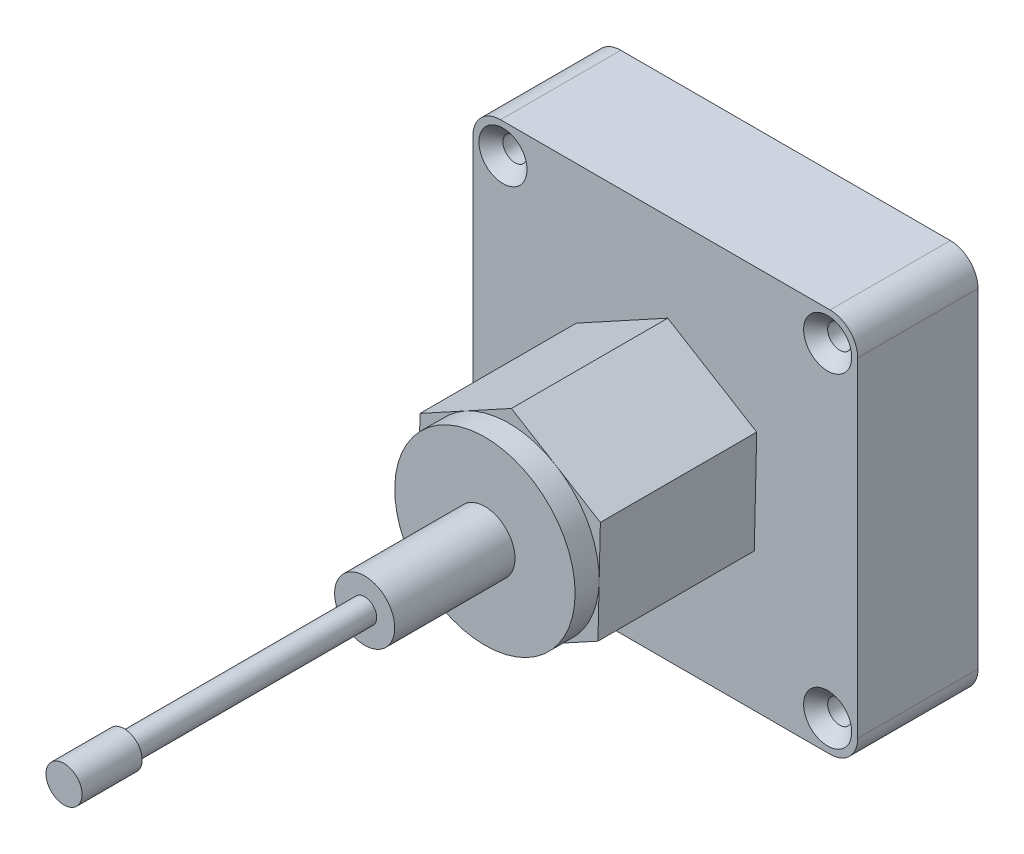
ISO-10303-21;
HEADER;
FILE_DESCRIPTION(('STEP AP214'),'2;1');
FILE_NAME('part.step','',(''),(''),'','','');
FILE_SCHEMA(('AUTOMOTIVE_DESIGN { 1 0 10303 214 1 1 1 1 }'));
ENDSEC;
DATA;
#1=APPLICATION_CONTEXT('core data for automotive mechanical design processes');
#2=APPLICATION_PROTOCOL_DEFINITION('international standard','automotive_design',2000,#1);
#3=PRODUCT_CONTEXT('',#1,'mechanical');
#4=PRODUCT('Part','Part','',(#3));
#5=PRODUCT_RELATED_PRODUCT_CATEGORY('part','',(#4));
#6=PRODUCT_DEFINITION_FORMATION('','',#4);
#7=PRODUCT_DEFINITION_CONTEXT('part definition',#1,'design');
#8=PRODUCT_DEFINITION('design','',#6,#7);
#9=PRODUCT_DEFINITION_SHAPE('','',#8);
#10=(LENGTH_UNIT() NAMED_UNIT(*) SI_UNIT(.MILLI.,.METRE.));
#11=(NAMED_UNIT(*) PLANE_ANGLE_UNIT() SI_UNIT($,.RADIAN.));
#12=(NAMED_UNIT(*) SI_UNIT($,.STERADIAN.) SOLID_ANGLE_UNIT());
#13=UNCERTAINTY_MEASURE_WITH_UNIT(LENGTH_MEASURE(1.E-05),#10,'distance_accuracy_value','');
#14=(GEOMETRIC_REPRESENTATION_CONTEXT(3) GLOBAL_UNCERTAINTY_ASSIGNED_CONTEXT((#13)) GLOBAL_UNIT_ASSIGNED_CONTEXT((#10,
#11,#12)) REPRESENTATION_CONTEXT('',''));
#15=CARTESIAN_POINT('',(0.,0.,0.));
#16=DIRECTION('',(0.,0.,1.));
#17=DIRECTION('',(1.,0.,0.));
#18=AXIS2_PLACEMENT_3D('',#15,#16,#17);
#19=CARTESIAN_POINT('',(0.,0.,0.));
#20=DIRECTION('',(0.,0.,1.));
#21=DIRECTION('',(1.,0.,0.));
#22=AXIS2_PLACEMENT_3D('',#19,#20,#21);
#23=PLANE('',#22);
#24=CARTESIAN_POINT('',(0.,0.,0.));
#25=DIRECTION('',(0.,0.,1.));
#26=DIRECTION('',(1.,0.,0.));
#27=AXIS2_PLACEMENT_3D('',#24,#25,#26);
#28=CIRCLE('',#27,7.5);
#29=CARTESIAN_POINT('',(3.90024317987458,6.4060989016594,0.));
#30=VERTEX_POINT('',#29);
#31=CARTESIAN_POINT('',(-3.59772279805534,6.58075912553809,0.));
#32=VERTEX_POINT('',#31);
#33=EDGE_CURVE('E233',#30,#32,#28,.T.);
#34=ORIENTED_EDGE('',*,*,#33,.F.);
#35=DIRECTION('',(-0.854146520221254,0.520032423983277,0.));
#36=VECTOR('',#35,1.);
#37=CARTESIAN_POINT('',(7.598806105203,4.15429245185381,0.));
#38=LINE('',#37,#36);
#39=CARTESIAN_POINT('',(0.201680254546159,8.657905351465,0.));
#40=VERTEX_POINT('',#39);
#41=EDGE_CURVE('E250',#30,#40,#38,.T.);
#42=ORIENTED_EDGE('',*,*,#41,.T.);
#43=DIRECTION('',(-0.877434550071745,-0.479696373074046,0.));
#44=VECTOR('',#43,1.);
#45=CARTESIAN_POINT('',(0.201680254546159,8.657905351465,0.));
#46=LINE('',#45,#44);
#47=EDGE_CURVE('E254',#40,#32,#46,.T.);
#48=ORIENTED_EDGE('',*,*,#47,.T.);
#49=EDGE_LOOP('',(#34,#42,#48));
#50=FACE_BOUND('',#49,.T.);
#51=ADVANCED_FACE('F45',(#50),#23,.T.);
#52=CARTESIAN_POINT('',(-7.49796597792992,0.174660223878687,0.));
#53=VERTEX_POINT('',#52);
#54=EDGE_CURVE('E236',#32,#53,#28,.T.);
#55=ORIENTED_EDGE('',*,*,#54,.F.);
#56=CARTESIAN_POINT('',(-7.39712585065684,4.50361289961119,0.));
#57=VERTEX_POINT('',#56);
#58=EDGE_CURVE('E253',#32,#57,#46,.T.);
#59=ORIENTED_EDGE('',*,*,#58,.T.);
#60=DIRECTION('',(-0.0232880298504916,-0.999728797057323,0.));
#61=VECTOR('',#60,1.);
#62=CARTESIAN_POINT('',(-7.39712585065684,4.50361289961119,0.));
#63=LINE('',#62,#61);
#64=EDGE_CURVE('E258',#57,#53,#63,.T.);
#65=ORIENTED_EDGE('',*,*,#64,.T.);
#66=EDGE_LOOP('',(#55,#59,#65));
#67=FACE_BOUND('',#66,.T.);
#68=ADVANCED_FACE('F406',(#67),#23,.T.);
#69=CARTESIAN_POINT('',(-3.90024317987458,-6.4060989016594,0.));
#70=VERTEX_POINT('',#69);
#71=EDGE_CURVE('E69',#53,#70,#28,.T.);
#72=ORIENTED_EDGE('',*,*,#71,.F.);
#73=CARTESIAN_POINT('',(-7.598806105203,-4.15429245185381,0.));
#74=VERTEX_POINT('',#73);
#75=EDGE_CURVE('E257',#53,#74,#63,.T.);
#76=ORIENTED_EDGE('',*,*,#75,.T.);
#77=DIRECTION('',(0.854146520221254,-0.520032423983278,0.));
#78=VECTOR('',#77,1.);
#79=CARTESIAN_POINT('',(-7.598806105203,-4.15429245185381,0.));
#80=LINE('',#79,#78);
#81=EDGE_CURVE('E262',#74,#70,#80,.T.);
#82=ORIENTED_EDGE('',*,*,#81,.T.);
#83=EDGE_LOOP('',(#72,#76,#82));
#84=FACE_BOUND('',#83,.T.);
#85=ADVANCED_FACE('F413',(#84),#23,.T.);
#86=CARTESIAN_POINT('',(3.59772279805534,-6.58075912553809,0.));
#87=VERTEX_POINT('',#86);
#88=EDGE_CURVE('E61',#70,#87,#28,.T.);
#89=ORIENTED_EDGE('',*,*,#88,.F.);
#90=CARTESIAN_POINT('',(-0.201680254546153,-8.657905351465,0.));
#91=VERTEX_POINT('',#90);
#92=EDGE_CURVE('E261',#70,#91,#80,.T.);
#93=ORIENTED_EDGE('',*,*,#92,.T.);
#94=DIRECTION('',(0.877434550071745,0.479696373074046,0.));
#95=VECTOR('',#94,1.);
#96=CARTESIAN_POINT('',(-0.201680254546153,-8.657905351465,0.));
#97=LINE('',#96,#95);
#98=EDGE_CURVE('E244',#91,#87,#97,.T.);
#99=ORIENTED_EDGE('',*,*,#98,.T.);
#100=EDGE_LOOP('',(#89,#93,#99));
#101=FACE_BOUND('',#100,.T.);
#102=ADVANCED_FACE('F434',(#101),#23,.T.);
#103=CARTESIAN_POINT('',(7.49796597792992,-0.174660223878683,0.));
#104=VERTEX_POINT('',#103);
#105=EDGE_CURVE('E444',#87,#104,#28,.T.);
#106=ORIENTED_EDGE('',*,*,#105,.F.);
#107=CARTESIAN_POINT('',(7.39712585065685,-4.50361289961119,0.));
#108=VERTEX_POINT('',#107);
#109=EDGE_CURVE('E240',#87,#108,#97,.T.);
#110=ORIENTED_EDGE('',*,*,#109,.T.);
#111=DIRECTION('',(0.0232880298504911,0.999728797057323,0.));
#112=VECTOR('',#111,1.);
#113=CARTESIAN_POINT('',(7.39712585065685,-4.50361289961119,0.));
#114=LINE('',#113,#112);
#115=EDGE_CURVE('E247',#108,#104,#114,.T.);
#116=ORIENTED_EDGE('',*,*,#115,.T.);
#117=EDGE_LOOP('',(#106,#110,#116));
#118=FACE_BOUND('',#117,.T.);
#119=ADVANCED_FACE('F422',(#118),#23,.T.);
#120=CARTESIAN_POINT('',(-0.201680254546153,-8.657905351465,-2.));
#121=DIRECTION('',(0.479696373074046,-0.877434550071745,0.));
#122=DIRECTION('',(0.877434550071745,0.479696373074046,0.));
#123=AXIS2_PLACEMENT_3D('',#120,#121,#122);
#124=PLANE('',#123);
#125=ORIENTED_EDGE('',*,*,#98,.F.);
#126=DIRECTION('',(0.,0.,1.));
#127=VECTOR('',#126,1.);
#128=CARTESIAN_POINT('',(-0.201680254546153,-8.657905351465,-2.));
#129=LINE('',#128,#127);
#130=CARTESIAN_POINT('',(-0.201680254546153,-8.657905351465,-13.));
#131=VERTEX_POINT('',#130);
#132=EDGE_CURVE('E265',#131,#91,#129,.T.);
#133=ORIENTED_EDGE('',*,*,#132,.F.);
#134=DIRECTION('',(-0.877434550071745,-0.479696373074046,0.));
#135=VECTOR('',#134,1.);
#136=CARTESIAN_POINT('',(-0.201680254546153,-8.657905351465,-13.));
#137=LINE('',#136,#135);
#138=CARTESIAN_POINT('',(7.39712585065685,-4.50361289961119,-13.));
#139=VERTEX_POINT('',#138);
#140=EDGE_CURVE('E196',#139,#131,#137,.T.);
#141=ORIENTED_EDGE('',*,*,#140,.F.);
#142=DIRECTION('',(0.,0.,1.));
#143=VECTOR('',#142,1.);
#144=CARTESIAN_POINT('',(7.39712585065685,-4.50361289961119,-2.));
#145=LINE('',#144,#143);
#146=EDGE_CURVE('E264',#139,#108,#145,.T.);
#147=ORIENTED_EDGE('',*,*,#146,.T.);
#148=ORIENTED_EDGE('',*,*,#109,.F.);
#149=EDGE_LOOP('',(#125,#133,#141,#147,#148));
#150=FACE_BOUND('',#149,.T.);
#151=ADVANCED_FACE('F433',(#150),#124,.T.);
#152=CARTESIAN_POINT('',(-7.598806105203,-4.15429245185381,-2.));
#153=DIRECTION('',(-0.520032423983278,-0.854146520221254,0.));
#154=DIRECTION('',(0.854146520221254,-0.520032423983278,0.));
#155=AXIS2_PLACEMENT_3D('',#152,#153,#154);
#156=PLANE('',#155);
#157=ORIENTED_EDGE('',*,*,#81,.F.);
#158=DIRECTION('',(0.,0.,1.));
#159=VECTOR('',#158,1.);
#160=CARTESIAN_POINT('',(-7.598806105203,-4.15429245185381,-2.));
#161=LINE('',#160,#159);
#162=CARTESIAN_POINT('',(-7.598806105203,-4.15429245185381,-13.));
#163=VERTEX_POINT('',#162);
#164=EDGE_CURVE('E268',#163,#74,#161,.T.);
#165=ORIENTED_EDGE('',*,*,#164,.F.);
#166=DIRECTION('',(-0.854146520221254,0.520032423983278,0.));
#167=VECTOR('',#166,1.);
#168=CARTESIAN_POINT('',(-7.598806105203,-4.15429245185381,-13.));
#169=LINE('',#168,#167);
#170=EDGE_CURVE('E204',#131,#163,#169,.T.);
#171=ORIENTED_EDGE('',*,*,#170,.F.);
#172=ORIENTED_EDGE('',*,*,#132,.T.);
#173=ORIENTED_EDGE('',*,*,#92,.F.);
#174=EDGE_LOOP('',(#157,#165,#171,#172,#173));
#175=FACE_BOUND('',#174,.T.);
#176=ADVANCED_FACE('F440',(#175),#156,.T.);
#177=CARTESIAN_POINT('',(-7.39712585065684,4.50361289961119,-2.));
#178=DIRECTION('',(-0.999728797057323,0.0232880298504916,0.));
#179=DIRECTION('',(-0.0232880298504916,-0.999728797057323,0.));
#180=AXIS2_PLACEMENT_3D('',#177,#178,#179);
#181=PLANE('',#180);
#182=ORIENTED_EDGE('',*,*,#64,.F.);
#183=DIRECTION('',(0.,0.,1.));
#184=VECTOR('',#183,1.);
#185=CARTESIAN_POINT('',(-7.39712585065684,4.50361289961119,-2.));
#186=LINE('',#185,#184);
#187=CARTESIAN_POINT('',(-7.39712585065684,4.50361289961119,-13.));
#188=VERTEX_POINT('',#187);
#189=EDGE_CURVE('E271',#188,#57,#186,.T.);
#190=ORIENTED_EDGE('',*,*,#189,.F.);
#191=DIRECTION('',(0.0232880298504916,0.999728797057323,0.));
#192=VECTOR('',#191,1.);
#193=CARTESIAN_POINT('',(-7.39712585065684,4.50361289961119,-13.));
#194=LINE('',#193,#192);
#195=EDGE_CURVE('E207',#163,#188,#194,.T.);
#196=ORIENTED_EDGE('',*,*,#195,.F.);
#197=ORIENTED_EDGE('',*,*,#164,.T.);
#198=ORIENTED_EDGE('',*,*,#75,.F.);
#199=EDGE_LOOP('',(#182,#190,#196,#197,#198));
#200=FACE_BOUND('',#199,.T.);
#201=ADVANCED_FACE('F465',(#200),#181,.T.);
#202=CARTESIAN_POINT('',(0.201680254546159,8.657905351465,-2.));
#203=DIRECTION('',(-0.479696373074046,0.877434550071745,0.));
#204=DIRECTION('',(-0.877434550071745,-0.479696373074046,0.));
#205=AXIS2_PLACEMENT_3D('',#202,#203,#204);
#206=PLANE('',#205);
#207=ORIENTED_EDGE('',*,*,#47,.F.);
#208=DIRECTION('',(0.,0.,1.));
#209=VECTOR('',#208,1.);
#210=CARTESIAN_POINT('',(0.201680254546159,8.657905351465,-2.));
#211=LINE('',#210,#209);
#212=CARTESIAN_POINT('',(0.201680254546159,8.657905351465,-13.));
#213=VERTEX_POINT('',#212);
#214=EDGE_CURVE('E274',#213,#40,#211,.T.);
#215=ORIENTED_EDGE('',*,*,#214,.F.);
#216=DIRECTION('',(0.877434550071745,0.479696373074046,0.));
#217=VECTOR('',#216,1.);
#218=CARTESIAN_POINT('',(0.201680254546159,8.657905351465,-13.));
#219=LINE('',#218,#217);
#220=EDGE_CURVE('E210',#188,#213,#219,.T.);
#221=ORIENTED_EDGE('',*,*,#220,.F.);
#222=ORIENTED_EDGE('',*,*,#189,.T.);
#223=ORIENTED_EDGE('',*,*,#58,.F.);
#224=EDGE_LOOP('',(#207,#215,#221,#222,#223));
#225=FACE_BOUND('',#224,.T.);
#226=ADVANCED_FACE('F456',(#225),#206,.T.);
#227=CARTESIAN_POINT('',(7.598806105203,4.15429245185381,-2.));
#228=DIRECTION('',(0.520032423983277,0.854146520221254,0.));
#229=DIRECTION('',(-0.854146520221254,0.520032423983277,0.));
#230=AXIS2_PLACEMENT_3D('',#227,#228,#229);
#231=PLANE('',#230);
#232=CARTESIAN_POINT('',(7.598806105203,4.15429245185381,0.));
#233=VERTEX_POINT('',#232);
#234=EDGE_CURVE('E251',#233,#30,#38,.T.);
#235=ORIENTED_EDGE('',*,*,#234,.F.);
#236=DIRECTION('',(0.,0.,1.));
#237=VECTOR('',#236,1.);
#238=CARTESIAN_POINT('',(7.598806105203,4.15429245185381,-2.));
#239=LINE('',#238,#237);
#240=CARTESIAN_POINT('',(7.598806105203,4.15429245185381,-13.));
#241=VERTEX_POINT('',#240);
#242=EDGE_CURVE('E277',#241,#233,#239,.T.);
#243=ORIENTED_EDGE('',*,*,#242,.F.);
#244=DIRECTION('',(0.854146520221254,-0.520032423983277,0.));
#245=VECTOR('',#244,1.);
#246=CARTESIAN_POINT('',(7.598806105203,4.15429245185381,-13.));
#247=LINE('',#246,#245);
#248=EDGE_CURVE('E213',#213,#241,#247,.T.);
#249=ORIENTED_EDGE('',*,*,#248,.F.);
#250=ORIENTED_EDGE('',*,*,#214,.T.);
#251=ORIENTED_EDGE('',*,*,#41,.F.);
#252=EDGE_LOOP('',(#235,#243,#249,#250,#251));
#253=FACE_BOUND('',#252,.T.);
#254=ADVANCED_FACE('F429',(#253),#231,.T.);
#255=CARTESIAN_POINT('',(7.39712585065685,-4.50361289961119,-2.));
#256=DIRECTION('',(0.999728797057323,-0.0232880298504911,0.));
#257=DIRECTION('',(0.0232880298504911,0.999728797057323,0.));
#258=AXIS2_PLACEMENT_3D('',#255,#256,#257);
#259=PLANE('',#258);
#260=ORIENTED_EDGE('',*,*,#115,.F.);
#261=ORIENTED_EDGE('',*,*,#146,.F.);
#262=DIRECTION('',(-0.0232880298504911,-0.999728797057323,0.));
#263=VECTOR('',#262,1.);
#264=CARTESIAN_POINT('',(7.39712585065685,-4.50361289961119,-13.));
#265=LINE('',#264,#263);
#266=EDGE_CURVE('E193',#241,#139,#265,.T.);
#267=ORIENTED_EDGE('',*,*,#266,.F.);
#268=ORIENTED_EDGE('',*,*,#242,.T.);
#269=EDGE_CURVE('E246',#104,#233,#114,.T.);
#270=ORIENTED_EDGE('',*,*,#269,.F.);
#271=EDGE_LOOP('',(#260,#261,#267,#268,#270));
#272=FACE_BOUND('',#271,.T.);
#273=ADVANCED_FACE('F420',(#272),#259,.T.);
#274=EDGE_CURVE('E243',#104,#30,#28,.T.);
#275=ORIENTED_EDGE('',*,*,#274,.F.);
#276=ORIENTED_EDGE('',*,*,#269,.T.);
#277=ORIENTED_EDGE('',*,*,#234,.T.);
#278=EDGE_LOOP('',(#275,#276,#277));
#279=FACE_BOUND('',#278,.T.);
#280=ADVANCED_FACE('F409',(#279),#23,.T.);
#281=CARTESIAN_POINT('',(0.,0.,2.));
#282=DIRECTION('',(0.,0.,-1.));
#283=DIRECTION('',(-1.,0.,0.));
#284=AXIS2_PLACEMENT_3D('',#281,#282,#283);
#285=CYLINDRICAL_SURFACE('',#284,7.5);
#286=CARTESIAN_POINT('',(0.,0.,2.));
#287=DIRECTION('',(0.,0.,1.));
#288=DIRECTION('',(1.,0.,0.));
#289=AXIS2_PLACEMENT_3D('',#286,#287,#288);
#290=CIRCLE('',#289,7.5);
#291=CARTESIAN_POINT('',(7.5,0.,2.));
#292=VERTEX_POINT('',#291);
#293=EDGE_CURVE('E237',#292,#292,#290,.T.);
#294=ORIENTED_EDGE('',*,*,#293,.F.);
#295=EDGE_LOOP('',(#294));
#296=FACE_BOUND('',#295,.T.);
#297=ORIENTED_EDGE('',*,*,#33,.T.);
#298=ORIENTED_EDGE('',*,*,#54,.T.);
#299=ORIENTED_EDGE('',*,*,#71,.T.);
#300=ORIENTED_EDGE('',*,*,#88,.T.);
#301=ORIENTED_EDGE('',*,*,#105,.T.);
#302=ORIENTED_EDGE('',*,*,#274,.T.);
#303=EDGE_LOOP('',(#297,#298,#299,#300,#301,#302));
#304=FACE_BOUND('',#303,.T.);
#305=ADVANCED_FACE('F419',(#296,#304),#285,.T.);
#306=CARTESIAN_POINT('',(0.,0.,2.));
#307=DIRECTION('',(0.,0.,1.));
#308=DIRECTION('',(1.,0.,0.));
#309=AXIS2_PLACEMENT_3D('',#306,#307,#308);
#310=PLANE('',#309);
#311=CARTESIAN_POINT('',(0.,0.,2.));
#312=DIRECTION('',(0.,0.,1.));
#313=DIRECTION('',(1.,0.,0.));
#314=AXIS2_PLACEMENT_3D('',#311,#312,#313);
#315=CIRCLE('',#314,2.5);
#316=CARTESIAN_POINT('',(2.5,0.,2.));
#317=VERTEX_POINT('',#316);
#318=EDGE_CURVE('E230',#317,#317,#315,.T.);
#319=ORIENTED_EDGE('',*,*,#318,.F.);
#320=EDGE_LOOP('',(#319));
#321=FACE_BOUND('',#320,.T.);
#322=ORIENTED_EDGE('',*,*,#293,.T.);
#323=EDGE_LOOP('',(#322));
#324=FACE_BOUND('',#323,.T.);
#325=ADVANCED_FACE('F427',(#321,#324),#310,.T.);
#326=CARTESIAN_POINT('',(0.,0.,12.));
#327=DIRECTION('',(0.,0.,-1.));
#328=DIRECTION('',(-1.,0.,0.));
#329=AXIS2_PLACEMENT_3D('',#326,#327,#328);
#330=CYLINDRICAL_SURFACE('',#329,2.5);
#331=CARTESIAN_POINT('',(0.,0.,12.));
#332=DIRECTION('',(0.,0.,1.));
#333=DIRECTION('',(1.,0.,0.));
#334=AXIS2_PLACEMENT_3D('',#331,#332,#333);
#335=CIRCLE('',#334,2.5);
#336=CARTESIAN_POINT('',(2.5,0.,12.));
#337=VERTEX_POINT('',#336);
#338=EDGE_CURVE('E225',#337,#337,#335,.T.);
#339=ORIENTED_EDGE('',*,*,#338,.F.);
#340=EDGE_LOOP('',(#339));
#341=FACE_BOUND('',#340,.T.);
#342=ORIENTED_EDGE('',*,*,#318,.T.);
#343=EDGE_LOOP('',(#342));
#344=FACE_BOUND('',#343,.T.);
#345=ADVANCED_FACE('F739',(#341,#344),#330,.T.);
#346=CARTESIAN_POINT('',(0.,0.,12.));
#347=DIRECTION('',(0.,0.,1.));
#348=DIRECTION('',(1.,0.,0.));
#349=AXIS2_PLACEMENT_3D('',#346,#347,#348);
#350=PLANE('',#349);
#351=CARTESIAN_POINT('',(0.,0.,12.));
#352=DIRECTION('',(0.,0.,1.));
#353=DIRECTION('',(1.,0.,0.));
#354=AXIS2_PLACEMENT_3D('',#351,#352,#353);
#355=CIRCLE('',#354,1.);
#356=CARTESIAN_POINT('',(1.,0.,12.));
#357=VERTEX_POINT('',#356);
#358=EDGE_CURVE('E226',#357,#357,#355,.T.);
#359=ORIENTED_EDGE('',*,*,#358,.F.);
#360=EDGE_LOOP('',(#359));
#361=FACE_BOUND('',#360,.T.);
#362=ORIENTED_EDGE('',*,*,#338,.T.);
#363=EDGE_LOOP('',(#362));
#364=FACE_BOUND('',#363,.T.);
#365=ADVANCED_FACE('F728',(#361,#364),#350,.T.);
#366=CARTESIAN_POINT('',(0.,0.,32.));
#367=DIRECTION('',(0.,0.,-1.));
#368=DIRECTION('',(-1.,0.,0.));
#369=AXIS2_PLACEMENT_3D('',#366,#367,#368);
#370=CYLINDRICAL_SURFACE('',#369,1.);
#371=CARTESIAN_POINT('',(0.,0.,32.));
#372=DIRECTION('',(0.,0.,1.));
#373=DIRECTION('',(1.,0.,0.));
#374=AXIS2_PLACEMENT_3D('',#371,#372,#373);
#375=CIRCLE('',#374,1.);
#376=CARTESIAN_POINT('',(1.,0.,32.));
#377=VERTEX_POINT('',#376);
#378=EDGE_CURVE('E220',#377,#377,#375,.T.);
#379=ORIENTED_EDGE('',*,*,#378,.F.);
#380=EDGE_LOOP('',(#379));
#381=FACE_BOUND('',#380,.T.);
#382=ORIENTED_EDGE('',*,*,#358,.T.);
#383=EDGE_LOOP('',(#382));
#384=FACE_BOUND('',#383,.T.);
#385=ADVANCED_FACE('F717',(#381,#384),#370,.T.);
#386=CARTESIAN_POINT('',(0.,0.,37.));
#387=DIRECTION('',(0.,0.,-1.));
#388=DIRECTION('',(-1.,0.,0.));
#389=AXIS2_PLACEMENT_3D('',#386,#387,#388);
#390=CYLINDRICAL_SURFACE('',#389,1.5);
#391=CARTESIAN_POINT('',(0.,0.,37.));
#392=DIRECTION('',(0.,0.,1.));
#393=DIRECTION('',(1.,0.,0.));
#394=AXIS2_PLACEMENT_3D('',#391,#392,#393);
#395=CIRCLE('',#394,1.5);
#396=CARTESIAN_POINT('',(1.5,0.,37.));
#397=VERTEX_POINT('',#396);
#398=EDGE_CURVE('E217',#397,#397,#395,.T.);
#399=ORIENTED_EDGE('',*,*,#398,.F.);
#400=EDGE_LOOP('',(#399));
#401=FACE_BOUND('',#400,.T.);
#402=CARTESIAN_POINT('',(0.,0.,32.));
#403=DIRECTION('',(0.,0.,1.));
#404=DIRECTION('',(1.,0.,0.));
#405=AXIS2_PLACEMENT_3D('',#402,#403,#404);
#406=CIRCLE('',#405,1.5);
#407=CARTESIAN_POINT('',(1.5,0.,32.));
#408=VERTEX_POINT('',#407);
#409=EDGE_CURVE('E216',#408,#408,#406,.T.);
#410=ORIENTED_EDGE('',*,*,#409,.T.);
#411=EDGE_LOOP('',(#410));
#412=FACE_BOUND('',#411,.T.);
#413=ADVANCED_FACE('F707',(#401,#412),#390,.T.);
#414=CARTESIAN_POINT('',(0.,0.,37.));
#415=DIRECTION('',(0.,0.,1.));
#416=DIRECTION('',(1.,0.,0.));
#417=AXIS2_PLACEMENT_3D('',#414,#415,#416);
#418=PLANE('',#417);
#419=ORIENTED_EDGE('',*,*,#398,.T.);
#420=EDGE_LOOP('',(#419));
#421=FACE_BOUND('',#420,.T.);
#422=ADVANCED_FACE('F401',(#421),#418,.T.);
#423=CARTESIAN_POINT('',(0.,0.,32.));
#424=DIRECTION('',(0.,0.,1.));
#425=DIRECTION('',(1.,0.,0.));
#426=AXIS2_PLACEMENT_3D('',#423,#424,#425);
#427=PLANE('',#426);
#428=ORIENTED_EDGE('',*,*,#378,.T.);
#429=EDGE_LOOP('',(#428));
#430=FACE_BOUND('',#429,.T.);
#431=ORIENTED_EDGE('',*,*,#409,.F.);
#432=EDGE_LOOP('',(#431));
#433=FACE_BOUND('',#432,.T.);
#434=ADVANCED_FACE('F396',(#430,#433),#427,.F.);
#435=CARTESIAN_POINT('',(-13.7,13.7,-23.));
#436=DIRECTION('',(0.,0.,1.));
#437=DIRECTION('',(1.,0.,0.));
#438=AXIS2_PLACEMENT_3D('',#435,#436,#437);
#439=PLANE('',#438);
#440=CARTESIAN_POINT('',(-13.7,13.7,-23.));
#441=DIRECTION('',(0.,0.,-1.));
#442=DIRECTION('',(1.,0.,0.));
#443=AXIS2_PLACEMENT_3D('',#440,#441,#442);
#444=CIRCLE('',#443,2.3);
#445=CARTESIAN_POINT('',(-16.,13.7,-23.));
#446=VERTEX_POINT('',#445);
#447=CARTESIAN_POINT('',(-13.7,16.,-23.));
#448=VERTEX_POINT('',#447);
#449=EDGE_CURVE('E178',#446,#448,#444,.T.);
#450=ORIENTED_EDGE('',*,*,#449,.T.);
#451=DIRECTION('',(1.,0.,0.));
#452=VECTOR('',#451,1.);
#453=CARTESIAN_POINT('',(13.7,16.,-23.));
#454=LINE('',#453,#452);
#455=CARTESIAN_POINT('',(13.7,16.,-23.));
#456=VERTEX_POINT('',#455);
#457=EDGE_CURVE('E167',#448,#456,#454,.T.);
#458=ORIENTED_EDGE('',*,*,#457,.T.);
#459=CARTESIAN_POINT('',(13.7,13.7,-23.));
#460=DIRECTION('',(0.,0.,-1.));
#461=DIRECTION('',(1.,0.,0.));
#462=AXIS2_PLACEMENT_3D('',#459,#460,#461);
#463=CIRCLE('',#462,2.3);
#464=CARTESIAN_POINT('',(16.,13.7,-23.));
#465=VERTEX_POINT('',#464);
#466=EDGE_CURVE('E177',#456,#465,#463,.T.);
#467=ORIENTED_EDGE('',*,*,#466,.T.);
#468=DIRECTION('',(0.,-1.,0.));
#469=VECTOR('',#468,1.);
#470=CARTESIAN_POINT('',(16.,13.7,-23.));
#471=LINE('',#470,#469);
#472=CARTESIAN_POINT('',(16.,-13.7,-23.));
#473=VERTEX_POINT('',#472);
#474=EDGE_CURVE('E363',#465,#473,#471,.T.);
#475=ORIENTED_EDGE('',*,*,#474,.T.);
#476=CARTESIAN_POINT('',(13.7,-13.7,-23.));
#477=DIRECTION('',(0.,0.,-1.));
#478=DIRECTION('',(1.,0.,0.));
#479=AXIS2_PLACEMENT_3D('',#476,#477,#478);
#480=CIRCLE('',#479,2.3);
#481=CARTESIAN_POINT('',(13.7,-16.,-23.));
#482=VERTEX_POINT('',#481);
#483=EDGE_CURVE('E378',#473,#482,#480,.T.);
#484=ORIENTED_EDGE('',*,*,#483,.T.);
#485=DIRECTION('',(-1.,0.,0.));
#486=VECTOR('',#485,1.);
#487=CARTESIAN_POINT('',(13.7,-16.,-23.));
#488=LINE('',#487,#486);
#489=CARTESIAN_POINT('',(-13.7,-16.,-23.));
#490=VERTEX_POINT('',#489);
#491=EDGE_CURVE('E375',#482,#490,#488,.T.);
#492=ORIENTED_EDGE('',*,*,#491,.T.);
#493=CARTESIAN_POINT('',(-13.7,-13.7,-23.));
#494=DIRECTION('',(0.,0.,-1.));
#495=DIRECTION('',(-1.,0.,0.));
#496=AXIS2_PLACEMENT_3D('',#493,#494,#495);
#497=CIRCLE('',#496,2.3);
#498=CARTESIAN_POINT('',(-16.,-13.7,-23.));
#499=VERTEX_POINT('',#498);
#500=EDGE_CURVE('E377',#490,#499,#497,.T.);
#501=ORIENTED_EDGE('',*,*,#500,.T.);
#502=DIRECTION('',(0.,1.,0.));
#503=VECTOR('',#502,1.);
#504=CARTESIAN_POINT('',(-16.,13.7,-23.));
#505=LINE('',#504,#503);
#506=EDGE_CURVE('E184',#499,#446,#505,.T.);
#507=ORIENTED_EDGE('',*,*,#506,.T.);
#508=EDGE_LOOP('',(#450,#458,#467,#475,#484,#492,#501,#507));
#509=FACE_BOUND('',#508,.T.);
#510=CARTESIAN_POINT('',(13.5,13.5,-23.));
#511=DIRECTION('',(0.,0.,-1.));
#512=DIRECTION('',(-1.,0.,0.));
#513=AXIS2_PLACEMENT_3D('',#510,#511,#512);
#514=CIRCLE('',#513,1.);
#515=CARTESIAN_POINT('',(12.5,13.5,-23.));
#516=VERTEX_POINT('',#515);
#517=EDGE_CURVE('E323',#516,#516,#514,.T.);
#518=ORIENTED_EDGE('',*,*,#517,.F.);
#519=EDGE_LOOP('',(#518));
#520=FACE_BOUND('',#519,.T.);
#521=CARTESIAN_POINT('',(-13.5,13.5,-23.));
#522=DIRECTION('',(0.,0.,-1.));
#523=DIRECTION('',(-1.,0.,0.));
#524=AXIS2_PLACEMENT_3D('',#521,#522,#523);
#525=CIRCLE('',#524,0.999999999999999);
#526=CARTESIAN_POINT('',(-14.5,13.5,-23.));
#527=VERTEX_POINT('',#526);
#528=EDGE_CURVE('E328',#527,#527,#525,.T.);
#529=ORIENTED_EDGE('',*,*,#528,.F.);
#530=EDGE_LOOP('',(#529));
#531=FACE_BOUND('',#530,.T.);
#532=CARTESIAN_POINT('',(-13.5,-13.5,-23.));
#533=DIRECTION('',(0.,0.,-1.));
#534=DIRECTION('',(-1.,0.,0.));
#535=AXIS2_PLACEMENT_3D('',#532,#533,#534);
#536=CIRCLE('',#535,1.);
#537=CARTESIAN_POINT('',(-14.5,-13.5,-23.));
#538=VERTEX_POINT('',#537);
#539=EDGE_CURVE('E386',#538,#538,#536,.T.);
#540=ORIENTED_EDGE('',*,*,#539,.F.);
#541=EDGE_LOOP('',(#540));
#542=FACE_BOUND('',#541,.T.);
#543=CARTESIAN_POINT('',(13.5,-13.5,-23.));
#544=DIRECTION('',(0.,0.,-1.));
#545=DIRECTION('',(-1.,0.,0.));
#546=AXIS2_PLACEMENT_3D('',#543,#544,#545);
#547=CIRCLE('',#546,0.999999999999999);
#548=CARTESIAN_POINT('',(12.5,-13.5,-23.));
#549=VERTEX_POINT('',#548);
#550=EDGE_CURVE('E389',#549,#549,#547,.T.);
#551=ORIENTED_EDGE('',*,*,#550,.F.);
#552=EDGE_LOOP('',(#551));
#553=FACE_BOUND('',#552,.T.);
#554=ADVANCED_FACE('F181',(#509,#520,#531,#542,#553),#439,.F.);
#555=CARTESIAN_POINT('',(-13.7,13.7,-13.));
#556=DIRECTION('',(0.,0.,1.));
#557=DIRECTION('',(1.,0.,0.));
#558=AXIS2_PLACEMENT_3D('',#555,#556,#557);
#559=PLANE('',#558);
#560=CARTESIAN_POINT('',(13.5,-13.5,-13.));
#561=DIRECTION('',(0.,0.,1.));
#562=DIRECTION('',(1.,0.,0.));
#563=AXIS2_PLACEMENT_3D('',#560,#561,#562);
#564=CIRCLE('',#563,2.);
#565=CARTESIAN_POINT('',(15.5,-13.5,-13.));
#566=VERTEX_POINT('',#565);
#567=EDGE_CURVE('E290',#566,#566,#564,.F.);
#568=ORIENTED_EDGE('',*,*,#567,.T.);
#569=EDGE_LOOP('',(#568));
#570=FACE_BOUND('',#569,.T.);
#571=CARTESIAN_POINT('',(13.5,13.5,-13.));
#572=DIRECTION('',(0.,0.,1.));
#573=DIRECTION('',(1.,0.,0.));
#574=AXIS2_PLACEMENT_3D('',#571,#572,#573);
#575=CIRCLE('',#574,2.);
#576=CARTESIAN_POINT('',(15.5,13.5,-13.));
#577=VERTEX_POINT('',#576);
#578=EDGE_CURVE('E287',#577,#577,#575,.F.);
#579=ORIENTED_EDGE('',*,*,#578,.T.);
#580=EDGE_LOOP('',(#579));
#581=FACE_BOUND('',#580,.T.);
#582=CARTESIAN_POINT('',(-13.5,13.5,-13.));
#583=DIRECTION('',(0.,0.,1.));
#584=DIRECTION('',(1.,0.,0.));
#585=AXIS2_PLACEMENT_3D('',#582,#583,#584);
#586=CIRCLE('',#585,2.);
#587=CARTESIAN_POINT('',(-11.5,13.5,-13.));
#588=VERTEX_POINT('',#587);
#589=EDGE_CURVE('E284',#588,#588,#586,.F.);
#590=ORIENTED_EDGE('',*,*,#589,.T.);
#591=EDGE_LOOP('',(#590));
#592=FACE_BOUND('',#591,.T.);
#593=CARTESIAN_POINT('',(-13.5,-13.5,-13.));
#594=DIRECTION('',(0.,0.,1.));
#595=DIRECTION('',(1.,0.,0.));
#596=AXIS2_PLACEMENT_3D('',#593,#594,#595);
#597=CIRCLE('',#596,2.);
#598=CARTESIAN_POINT('',(-11.5,-13.5,-13.));
#599=VERTEX_POINT('',#598);
#600=EDGE_CURVE('E229',#599,#599,#597,.F.);
#601=ORIENTED_EDGE('',*,*,#600,.T.);
#602=EDGE_LOOP('',(#601));
#603=FACE_BOUND('',#602,.T.);
#604=ORIENTED_EDGE('',*,*,#248,.T.);
#605=ORIENTED_EDGE('',*,*,#266,.T.);
#606=ORIENTED_EDGE('',*,*,#140,.T.);
#607=ORIENTED_EDGE('',*,*,#170,.T.);
#608=ORIENTED_EDGE('',*,*,#195,.T.);
#609=ORIENTED_EDGE('',*,*,#220,.T.);
#610=EDGE_LOOP('',(#604,#605,#606,#607,#608,#609));
#611=FACE_BOUND('',#610,.T.);
#612=CARTESIAN_POINT('',(-13.7,13.7,-13.));
#613=DIRECTION('',(0.,0.,-1.));
#614=DIRECTION('',(1.,0.,0.));
#615=AXIS2_PLACEMENT_3D('',#612,#613,#614);
#616=CIRCLE('',#615,2.3);
#617=CARTESIAN_POINT('',(-16.,13.7,-13.));
#618=VERTEX_POINT('',#617);
#619=CARTESIAN_POINT('',(-13.7,16.,-13.));
#620=VERTEX_POINT('',#619);
#621=EDGE_CURVE('E192',#618,#620,#616,.T.);
#622=ORIENTED_EDGE('',*,*,#621,.F.);
#623=DIRECTION('',(0.,1.,0.));
#624=VECTOR('',#623,1.);
#625=CARTESIAN_POINT('',(-16.,13.7,-13.));
#626=LINE('',#625,#624);
#627=CARTESIAN_POINT('',(-16.,-13.7,-13.));
#628=VERTEX_POINT('',#627);
#629=EDGE_CURVE('E188',#628,#618,#626,.T.);
#630=ORIENTED_EDGE('',*,*,#629,.F.);
#631=CARTESIAN_POINT('',(-13.7,-13.7,-13.));
#632=DIRECTION('',(0.,0.,-1.));
#633=DIRECTION('',(-1.,0.,0.));
#634=AXIS2_PLACEMENT_3D('',#631,#632,#633);
#635=CIRCLE('',#634,2.3);
#636=CARTESIAN_POINT('',(-13.7,-16.,-13.));
#637=VERTEX_POINT('',#636);
#638=EDGE_CURVE('E340',#637,#628,#635,.T.);
#639=ORIENTED_EDGE('',*,*,#638,.F.);
#640=DIRECTION('',(-1.,0.,0.));
#641=VECTOR('',#640,1.);
#642=CARTESIAN_POINT('',(13.7,-16.,-13.));
#643=LINE('',#642,#641);
#644=CARTESIAN_POINT('',(13.7,-16.,-13.));
#645=VERTEX_POINT('',#644);
#646=EDGE_CURVE('E338',#645,#637,#643,.T.);
#647=ORIENTED_EDGE('',*,*,#646,.F.);
#648=CARTESIAN_POINT('',(13.7,-13.7,-13.));
#649=DIRECTION('',(0.,0.,-1.));
#650=DIRECTION('',(1.,0.,0.));
#651=AXIS2_PLACEMENT_3D('',#648,#649,#650);
#652=CIRCLE('',#651,2.3);
#653=CARTESIAN_POINT('',(16.,-13.7,-13.));
#654=VERTEX_POINT('',#653);
#655=EDGE_CURVE('E336',#654,#645,#652,.T.);
#656=ORIENTED_EDGE('',*,*,#655,.F.);
#657=DIRECTION('',(0.,-1.,0.));
#658=VECTOR('',#657,1.);
#659=CARTESIAN_POINT('',(16.,13.7,-13.));
#660=LINE('',#659,#658);
#661=CARTESIAN_POINT('',(16.,13.7,-13.));
#662=VERTEX_POINT('',#661);
#663=EDGE_CURVE('E334',#662,#654,#660,.T.);
#664=ORIENTED_EDGE('',*,*,#663,.F.);
#665=CARTESIAN_POINT('',(13.7,13.7,-13.));
#666=DIRECTION('',(0.,0.,-1.));
#667=DIRECTION('',(1.,0.,0.));
#668=AXIS2_PLACEMENT_3D('',#665,#666,#667);
#669=CIRCLE('',#668,2.3);
#670=CARTESIAN_POINT('',(13.7,16.,-13.));
#671=VERTEX_POINT('',#670);
#672=EDGE_CURVE('E325',#671,#662,#669,.T.);
#673=ORIENTED_EDGE('',*,*,#672,.F.);
#674=DIRECTION('',(1.,0.,0.));
#675=VECTOR('',#674,1.);
#676=CARTESIAN_POINT('',(13.7,16.,-13.));
#677=LINE('',#676,#675);
#678=EDGE_CURVE('E322',#620,#671,#677,.T.);
#679=ORIENTED_EDGE('',*,*,#678,.F.);
#680=EDGE_LOOP('',(#622,#630,#639,#647,#656,#664,#673,#679));
#681=FACE_BOUND('',#680,.T.);
#682=ADVANCED_FACE('F310',(#570,#581,#592,#603,#611,#681),#559,.T.);
#683=CARTESIAN_POINT('',(-13.7,13.7,-23.));
#684=DIRECTION('',(0.,0.,1.));
#685=DIRECTION('',(1.,0.,0.));
#686=AXIS2_PLACEMENT_3D('',#683,#684,#685);
#687=CYLINDRICAL_SURFACE('',#686,2.3);
#688=ORIENTED_EDGE('',*,*,#621,.T.);
#689=DIRECTION('',(0.,0.,1.));
#690=VECTOR('',#689,1.);
#691=CARTESIAN_POINT('',(-13.7,16.,-23.));
#692=LINE('',#691,#690);
#693=EDGE_CURVE('E171',#448,#620,#692,.T.);
#694=ORIENTED_EDGE('',*,*,#693,.F.);
#695=ORIENTED_EDGE('',*,*,#449,.F.);
#696=DIRECTION('',(0.,0.,1.));
#697=VECTOR('',#696,1.);
#698=CARTESIAN_POINT('',(-16.,13.7,-23.));
#699=LINE('',#698,#697);
#700=EDGE_CURVE('E343',#446,#618,#699,.T.);
#701=ORIENTED_EDGE('',*,*,#700,.T.);
#702=EDGE_LOOP('',(#688,#694,#695,#701));
#703=FACE_BOUND('',#702,.T.);
#704=ADVANCED_FACE('F190',(#703),#687,.T.);
#705=CARTESIAN_POINT('',(13.7,16.,-23.));
#706=DIRECTION('',(0.,-1.,0.));
#707=DIRECTION('',(0.,0.,-1.));
#708=AXIS2_PLACEMENT_3D('',#705,#706,#707);
#709=PLANE('',#708);
#710=ORIENTED_EDGE('',*,*,#678,.T.);
#711=DIRECTION('',(0.,0.,1.));
#712=VECTOR('',#711,1.);
#713=CARTESIAN_POINT('',(13.7,16.,-23.));
#714=LINE('',#713,#712);
#715=EDGE_CURVE('E174',#456,#671,#714,.T.);
#716=ORIENTED_EDGE('',*,*,#715,.F.);
#717=ORIENTED_EDGE('',*,*,#457,.F.);
#718=ORIENTED_EDGE('',*,*,#693,.T.);
#719=EDGE_LOOP('',(#710,#716,#717,#718));
#720=FACE_BOUND('',#719,.T.);
#721=ADVANCED_FACE('F169',(#720),#709,.F.);
#722=CARTESIAN_POINT('',(13.7,13.7,-23.));
#723=DIRECTION('',(0.,0.,1.));
#724=DIRECTION('',(1.,0.,0.));
#725=AXIS2_PLACEMENT_3D('',#722,#723,#724);
#726=CYLINDRICAL_SURFACE('',#725,2.3);
#727=ORIENTED_EDGE('',*,*,#672,.T.);
#728=DIRECTION('',(0.,0.,1.));
#729=VECTOR('',#728,1.);
#730=CARTESIAN_POINT('',(16.,13.7,-23.));
#731=LINE('',#730,#729);
#732=EDGE_CURVE('E198',#465,#662,#731,.T.);
#733=ORIENTED_EDGE('',*,*,#732,.F.);
#734=ORIENTED_EDGE('',*,*,#466,.F.);
#735=ORIENTED_EDGE('',*,*,#715,.T.);
#736=EDGE_LOOP('',(#727,#733,#734,#735));
#737=FACE_BOUND('',#736,.T.);
#738=ADVANCED_FACE('F619',(#737),#726,.T.);
#739=CARTESIAN_POINT('',(16.,13.7,-23.));
#740=DIRECTION('',(-1.,0.,0.));
#741=DIRECTION('',(0.,0.,1.));
#742=AXIS2_PLACEMENT_3D('',#739,#740,#741);
#743=PLANE('',#742);
#744=ORIENTED_EDGE('',*,*,#663,.T.);
#745=DIRECTION('',(0.,0.,1.));
#746=VECTOR('',#745,1.);
#747=CARTESIAN_POINT('',(16.,-13.7,-23.));
#748=LINE('',#747,#746);
#749=EDGE_CURVE('E354',#473,#654,#748,.T.);
#750=ORIENTED_EDGE('',*,*,#749,.F.);
#751=ORIENTED_EDGE('',*,*,#474,.F.);
#752=ORIENTED_EDGE('',*,*,#732,.T.);
#753=EDGE_LOOP('',(#744,#750,#751,#752));
#754=FACE_BOUND('',#753,.T.);
#755=ADVANCED_FACE('F361',(#754),#743,.F.);
#756=CARTESIAN_POINT('',(13.7,-13.7,-23.));
#757=DIRECTION('',(0.,0.,1.));
#758=DIRECTION('',(1.,0.,0.));
#759=AXIS2_PLACEMENT_3D('',#756,#757,#758);
#760=CYLINDRICAL_SURFACE('',#759,2.3);
#761=ORIENTED_EDGE('',*,*,#655,.T.);
#762=DIRECTION('',(0.,0.,1.));
#763=VECTOR('',#762,1.);
#764=CARTESIAN_POINT('',(13.7,-16.,-23.));
#765=LINE('',#764,#763);
#766=EDGE_CURVE('E351',#482,#645,#765,.T.);
#767=ORIENTED_EDGE('',*,*,#766,.F.);
#768=ORIENTED_EDGE('',*,*,#483,.F.);
#769=ORIENTED_EDGE('',*,*,#749,.T.);
#770=EDGE_LOOP('',(#761,#767,#768,#769));
#771=FACE_BOUND('',#770,.T.);
#772=ADVANCED_FACE('F369',(#771),#760,.T.);
#773=CARTESIAN_POINT('',(13.7,-16.,-23.));
#774=DIRECTION('',(0.,1.,0.));
#775=DIRECTION('',(0.,0.,1.));
#776=AXIS2_PLACEMENT_3D('',#773,#774,#775);
#777=PLANE('',#776);
#778=ORIENTED_EDGE('',*,*,#646,.T.);
#779=DIRECTION('',(0.,0.,1.));
#780=VECTOR('',#779,1.);
#781=CARTESIAN_POINT('',(-13.7,-16.,-23.));
#782=LINE('',#781,#780);
#783=EDGE_CURVE('E348',#490,#637,#782,.T.);
#784=ORIENTED_EDGE('',*,*,#783,.F.);
#785=ORIENTED_EDGE('',*,*,#491,.F.);
#786=ORIENTED_EDGE('',*,*,#766,.T.);
#787=EDGE_LOOP('',(#778,#784,#785,#786));
#788=FACE_BOUND('',#787,.T.);
#789=ADVANCED_FACE('F373',(#788),#777,.F.);
#790=CARTESIAN_POINT('',(-13.7,-13.7,-23.));
#791=DIRECTION('',(0.,0.,1.));
#792=DIRECTION('',(1.,0.,0.));
#793=AXIS2_PLACEMENT_3D('',#790,#791,#792);
#794=CYLINDRICAL_SURFACE('',#793,2.3);
#795=ORIENTED_EDGE('',*,*,#638,.T.);
#796=DIRECTION('',(0.,0.,1.));
#797=VECTOR('',#796,1.);
#798=CARTESIAN_POINT('',(-16.,-13.7,-23.));
#799=LINE('',#798,#797);
#800=EDGE_CURVE('E345',#499,#628,#799,.T.);
#801=ORIENTED_EDGE('',*,*,#800,.F.);
#802=ORIENTED_EDGE('',*,*,#500,.F.);
#803=ORIENTED_EDGE('',*,*,#783,.T.);
#804=EDGE_LOOP('',(#795,#801,#802,#803));
#805=FACE_BOUND('',#804,.T.);
#806=ADVANCED_FACE('F584',(#805),#794,.T.);
#807=CARTESIAN_POINT('',(-16.,13.7,-23.));
#808=DIRECTION('',(1.,0.,0.));
#809=DIRECTION('',(0.,1.,0.));
#810=AXIS2_PLACEMENT_3D('',#807,#808,#809);
#811=PLANE('',#810);
#812=ORIENTED_EDGE('',*,*,#629,.T.);
#813=ORIENTED_EDGE('',*,*,#700,.F.);
#814=ORIENTED_EDGE('',*,*,#506,.F.);
#815=ORIENTED_EDGE('',*,*,#800,.T.);
#816=EDGE_LOOP('',(#812,#813,#814,#815));
#817=FACE_BOUND('',#816,.T.);
#818=ADVANCED_FACE('F506',(#817),#811,.F.);
#819=CARTESIAN_POINT('',(13.5,13.5,-23.));
#820=DIRECTION('',(0.,0.,1.));
#821=DIRECTION('',(1.,0.,0.));
#822=AXIS2_PLACEMENT_3D('',#819,#820,#821);
#823=CYLINDRICAL_SURFACE('',#822,1.);
#824=CARTESIAN_POINT('',(13.5,13.5,-14.));
#825=DIRECTION('',(0.,0.,1.));
#826=DIRECTION('',(1.,0.,0.));
#827=AXIS2_PLACEMENT_3D('',#824,#825,#826);
#828=CIRCLE('',#827,1.);
#829=CARTESIAN_POINT('',(14.5,13.5,-14.));
#830=VERTEX_POINT('',#829);
#831=EDGE_CURVE('E296',#830,#830,#828,.T.);
#832=ORIENTED_EDGE('',*,*,#831,.T.);
#833=EDGE_LOOP('',(#832));
#834=FACE_BOUND('',#833,.T.);
#835=ORIENTED_EDGE('',*,*,#517,.T.);
#836=EDGE_LOOP('',(#835));
#837=FACE_BOUND('',#836,.T.);
#838=ADVANCED_FACE('F503',(#834,#837),#823,.F.);
#839=CARTESIAN_POINT('',(-13.5,13.5,-23.));
#840=DIRECTION('',(0.,0.,1.));
#841=DIRECTION('',(1.,0.,0.));
#842=AXIS2_PLACEMENT_3D('',#839,#840,#841);
#843=CYLINDRICAL_SURFACE('',#842,0.999999999999999);
#844=CARTESIAN_POINT('',(-13.5,13.5,-14.));
#845=DIRECTION('',(0.,0.,1.));
#846=DIRECTION('',(1.,0.,0.));
#847=AXIS2_PLACEMENT_3D('',#844,#845,#846);
#848=CIRCLE('',#847,0.999999999999999);
#849=CARTESIAN_POINT('',(-12.5,13.5,-14.));
#850=VERTEX_POINT('',#849);
#851=EDGE_CURVE('E54',#850,#850,#848,.T.);
#852=ORIENTED_EDGE('',*,*,#851,.T.);
#853=EDGE_LOOP('',(#852));
#854=FACE_BOUND('',#853,.T.);
#855=ORIENTED_EDGE('',*,*,#528,.T.);
#856=EDGE_LOOP('',(#855));
#857=FACE_BOUND('',#856,.T.);
#858=ADVANCED_FACE('F301',(#854,#857),#843,.F.);
#859=CARTESIAN_POINT('',(-13.5,-13.5,-23.));
#860=DIRECTION('',(0.,0.,1.));
#861=DIRECTION('',(1.,0.,0.));
#862=AXIS2_PLACEMENT_3D('',#859,#860,#861);
#863=CYLINDRICAL_SURFACE('',#862,1.);
#864=CARTESIAN_POINT('',(-13.5,-13.5,-14.));
#865=DIRECTION('',(0.,0.,1.));
#866=DIRECTION('',(1.,0.,0.));
#867=AXIS2_PLACEMENT_3D('',#864,#865,#866);
#868=CIRCLE('',#867,1.);
#869=CARTESIAN_POINT('',(-12.5,-13.5,-14.));
#870=VERTEX_POINT('',#869);
#871=EDGE_CURVE('E11',#870,#870,#868,.T.);
#872=ORIENTED_EDGE('',*,*,#871,.T.);
#873=EDGE_LOOP('',(#872));
#874=FACE_BOUND('',#873,.T.);
#875=ORIENTED_EDGE('',*,*,#539,.T.);
#876=EDGE_LOOP('',(#875));
#877=FACE_BOUND('',#876,.T.);
#878=ADVANCED_FACE('F513',(#874,#877),#863,.F.);
#879=CARTESIAN_POINT('',(13.5,-13.5,-23.));
#880=DIRECTION('',(0.,0.,1.));
#881=DIRECTION('',(1.,0.,0.));
#882=AXIS2_PLACEMENT_3D('',#879,#880,#881);
#883=CYLINDRICAL_SURFACE('',#882,0.999999999999999);
#884=CARTESIAN_POINT('',(13.5,-13.5,-14.));
#885=DIRECTION('',(0.,0.,1.));
#886=DIRECTION('',(1.,0.,0.));
#887=AXIS2_PLACEMENT_3D('',#884,#885,#886);
#888=CIRCLE('',#887,0.999999999999999);
#889=CARTESIAN_POINT('',(14.5,-13.5,-14.));
#890=VERTEX_POINT('',#889);
#891=EDGE_CURVE('E293',#890,#890,#888,.T.);
#892=ORIENTED_EDGE('',*,*,#891,.T.);
#893=EDGE_LOOP('',(#892));
#894=FACE_BOUND('',#893,.T.);
#895=ORIENTED_EDGE('',*,*,#550,.T.);
#896=EDGE_LOOP('',(#895));
#897=FACE_BOUND('',#896,.T.);
#898=ADVANCED_FACE('F393',(#894,#897),#883,.F.);
#899=CARTESIAN_POINT('',(13.5,-13.5,-13.));
#900=DIRECTION('',(0.,0.,1.));
#901=DIRECTION('',(1.,0.,0.));
#902=AXIS2_PLACEMENT_3D('',#899,#900,#901);
#903=CONICAL_SURFACE('',#902,2.,0.785398163397447);
#904=ORIENTED_EDGE('',*,*,#891,.F.);
#905=EDGE_LOOP('',(#904));
#906=FACE_BOUND('',#905,.T.);
#907=ORIENTED_EDGE('',*,*,#567,.F.);
#908=EDGE_LOOP('',(#907));
#909=FACE_BOUND('',#908,.T.);
#910=ADVANCED_FACE('F480',(#906,#909),#903,.F.);
#911=CARTESIAN_POINT('',(13.5,13.5,-13.));
#912=DIRECTION('',(0.,0.,1.));
#913=DIRECTION('',(1.,0.,0.));
#914=AXIS2_PLACEMENT_3D('',#911,#912,#913);
#915=CONICAL_SURFACE('',#914,2.,0.785398163397447);
#916=ORIENTED_EDGE('',*,*,#831,.F.);
#917=EDGE_LOOP('',(#916));
#918=FACE_BOUND('',#917,.T.);
#919=ORIENTED_EDGE('',*,*,#578,.F.);
#920=EDGE_LOOP('',(#919));
#921=FACE_BOUND('',#920,.T.);
#922=ADVANCED_FACE('F307',(#918,#921),#915,.F.);
#923=CARTESIAN_POINT('',(-13.5,13.5,-13.));
#924=DIRECTION('',(0.,0.,1.));
#925=DIRECTION('',(1.,0.,0.));
#926=AXIS2_PLACEMENT_3D('',#923,#924,#925);
#927=CONICAL_SURFACE('',#926,2.,0.785398163397447);
#928=ORIENTED_EDGE('',*,*,#851,.F.);
#929=EDGE_LOOP('',(#928));
#930=FACE_BOUND('',#929,.T.);
#931=ORIENTED_EDGE('',*,*,#589,.F.);
#932=EDGE_LOOP('',(#931));
#933=FACE_BOUND('',#932,.T.);
#934=ADVANCED_FACE('F304',(#930,#933),#927,.F.);
#935=CARTESIAN_POINT('',(-13.5,-13.5,-13.));
#936=DIRECTION('',(0.,0.,1.));
#937=DIRECTION('',(1.,0.,0.));
#938=AXIS2_PLACEMENT_3D('',#935,#936,#937);
#939=CONICAL_SURFACE('',#938,2.,0.785398163397447);
#940=ORIENTED_EDGE('',*,*,#871,.F.);
#941=EDGE_LOOP('',(#940));
#942=FACE_BOUND('',#941,.T.);
#943=ORIENTED_EDGE('',*,*,#600,.F.);
#944=EDGE_LOOP('',(#943));
#945=FACE_BOUND('',#944,.T.);
#946=ADVANCED_FACE('F48',(#942,#945),#939,.F.);
#947=CLOSED_SHELL('',(#51,#68,#85,#102,#119,#151,#176,#201,#226,#254,#273,#280,#305,#325,#345,
#365,#385,#413,#422,#434,#554,#682,#704,#721,#738,#755,#772,#789,#806,#818,#838,#858,#878,#898,
#910,#922,#934,#946));
#948=MANIFOLD_SOLID_BREP('B2',#947);
#949=ADVANCED_BREP_SHAPE_REPRESENTATION('',(#18,#948),#14);
#950=SHAPE_DEFINITION_REPRESENTATION(#9,#949);
ENDSEC;
END-ISO-10303-21;
